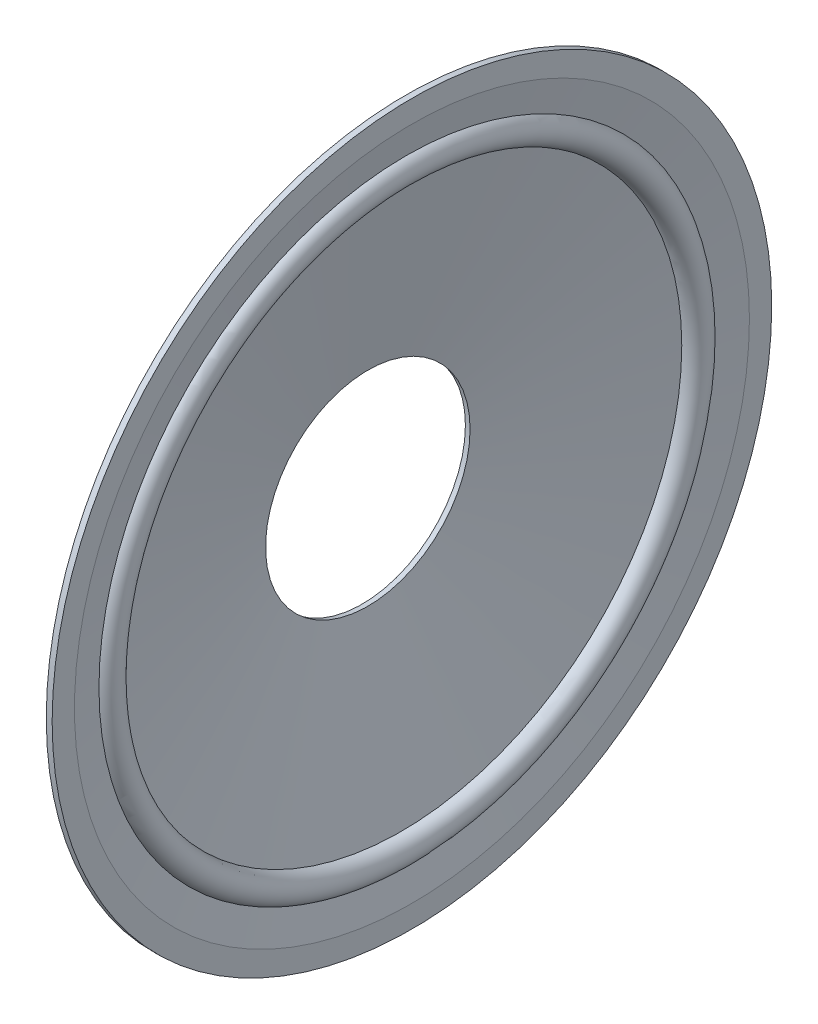
ISO-10303-21;
HEADER;
FILE_DESCRIPTION(('STEP AP214'),'2;1');
FILE_NAME('part.step','',(''),(''),'','','');
FILE_SCHEMA(('AUTOMOTIVE_DESIGN { 1 0 10303 214 1 1 1 1 }'));
ENDSEC;
DATA;
#1=APPLICATION_CONTEXT('core data for automotive mechanical design processes');
#2=APPLICATION_PROTOCOL_DEFINITION('international standard','automotive_design',2000,#1);
#3=PRODUCT_CONTEXT('',#1,'mechanical');
#4=PRODUCT('Part','Part','',(#3));
#5=PRODUCT_RELATED_PRODUCT_CATEGORY('part','',(#4));
#6=PRODUCT_DEFINITION_FORMATION('','',#4);
#7=PRODUCT_DEFINITION_CONTEXT('part definition',#1,'design');
#8=PRODUCT_DEFINITION('design','',#6,#7);
#9=PRODUCT_DEFINITION_SHAPE('','',#8);
#10=(LENGTH_UNIT() NAMED_UNIT(*) SI_UNIT(.MILLI.,.METRE.));
#11=(NAMED_UNIT(*) PLANE_ANGLE_UNIT() SI_UNIT($,.RADIAN.));
#12=(NAMED_UNIT(*) SI_UNIT($,.STERADIAN.) SOLID_ANGLE_UNIT());
#13=UNCERTAINTY_MEASURE_WITH_UNIT(LENGTH_MEASURE(1.E-05),#10,'distance_accuracy_value','');
#14=(GEOMETRIC_REPRESENTATION_CONTEXT(3) GLOBAL_UNCERTAINTY_ASSIGNED_CONTEXT((#13)) GLOBAL_UNIT_ASSIGNED_CONTEXT((#10,
#11,#12)) REPRESENTATION_CONTEXT('',''));
#15=CARTESIAN_POINT('',(0.,0.,0.));
#16=DIRECTION('',(0.,0.,1.));
#17=DIRECTION('',(1.,0.,0.));
#18=AXIS2_PLACEMENT_3D('',#15,#16,#17);
#19=CARTESIAN_POINT('',(3.,0.,0.));
#20=DIRECTION('',(1.,0.,0.));
#21=DIRECTION('',(0.,0.,-1.));
#22=AXIS2_PLACEMENT_3D('',#19,#20,#21);
#23=CYLINDRICAL_SURFACE('',#22,24.5);
#24=CARTESIAN_POINT('',(3.2,0.,0.));
#25=DIRECTION('',(1.,0.,0.));
#26=DIRECTION('',(0.,0.,-1.));
#27=AXIS2_PLACEMENT_3D('',#24,#25,#26);
#28=CIRCLE('',#27,24.5);
#29=CARTESIAN_POINT('',(3.2,0.,-24.5));
#30=VERTEX_POINT('',#29);
#31=EDGE_CURVE('E52',#30,#30,#28,.T.);
#32=ORIENTED_EDGE('',*,*,#31,.F.);
#33=EDGE_LOOP('',(#32));
#34=FACE_BOUND('',#33,.T.);
#35=CARTESIAN_POINT('',(2.8,0.,0.));
#36=DIRECTION('',(1.,0.,0.));
#37=DIRECTION('',(0.,0.,-1.));
#38=AXIS2_PLACEMENT_3D('',#35,#36,#37);
#39=CIRCLE('',#38,24.5);
#40=CARTESIAN_POINT('',(2.8,0.,-24.5));
#41=VERTEX_POINT('',#40);
#42=EDGE_CURVE('E37',#41,#41,#39,.T.);
#43=ORIENTED_EDGE('',*,*,#42,.T.);
#44=EDGE_LOOP('',(#43));
#45=FACE_BOUND('',#44,.T.);
#46=ADVANCED_FACE('F34',(#34,#45),#23,.T.);
#47=CARTESIAN_POINT('',(0.,0.,0.));
#48=DIRECTION('',(-1.,0.,0.));
#49=DIRECTION('',(0.,0.,1.));
#50=AXIS2_PLACEMENT_3D('',#47,#48,#49);
#51=CONICAL_SURFACE('',#50,7.,0.185347949995695);
#52=CARTESIAN_POINT('',(0.196574437386864,0.,0.));
#53=DIRECTION('',(1.,0.,0.));
#54=DIRECTION('',(0.,0.,-1.));
#55=AXIS2_PLACEMENT_3D('',#52,#53,#54);
#56=CIRCLE('',#55,6.96314229298996);
#57=CARTESIAN_POINT('',(0.196574437386864,0.,-6.96314229298996));
#58=VERTEX_POINT('',#57);
#59=EDGE_CURVE('E10',#58,#58,#56,.T.);
#60=ORIENTED_EDGE('',*,*,#59,.T.);
#61=EDGE_LOOP('',(#60));
#62=FACE_BOUND('',#61,.T.);
#63=CARTESIAN_POINT('',(-0.196574437386864,0.,0.));
#64=DIRECTION('',(1.,0.,0.));
#65=DIRECTION('',(0.,0.,-1.));
#66=AXIS2_PLACEMENT_3D('',#63,#64,#65);
#67=CIRCLE('',#66,7.03685770701004);
#68=CARTESIAN_POINT('',(-0.196574437386864,0.,-7.03685770701004));
#69=VERTEX_POINT('',#68);
#70=EDGE_CURVE('E58',#69,#69,#67,.T.);
#71=ORIENTED_EDGE('',*,*,#70,.F.);
#72=EDGE_LOOP('',(#71));
#73=FACE_BOUND('',#72,.T.);
#74=ADVANCED_FACE('F94',(#62,#73),#51,.F.);
#75=CARTESIAN_POINT('',(0.196574437386864,0.,0.));
#76=DIRECTION('',(1.,0.,0.));
#77=DIRECTION('',(0.,0.,-1.));
#78=AXIS2_PLACEMENT_3D('',#75,#76,#77);
#79=CONICAL_SURFACE('',#78,6.96314229298996,1.3854483767992);
#80=CARTESIAN_POINT('',(2.47255845148829,0.,0.));
#81=DIRECTION('',(1.,0.,0.));
#82=DIRECTION('',(0.,0.,-1.));
#83=AXIS2_PLACEMENT_3D('',#80,#81,#82);
#84=CIRCLE('',#83,19.1017237015309);
#85=CARTESIAN_POINT('',(2.47255845148829,0.,-19.1017237015309));
#86=VERTEX_POINT('',#85);
#87=EDGE_CURVE('E41',#86,#86,#84,.T.);
#88=ORIENTED_EDGE('',*,*,#87,.T.);
#89=EDGE_LOOP('',(#88));
#90=FACE_BOUND('',#89,.T.);
#91=ORIENTED_EDGE('',*,*,#59,.F.);
#92=EDGE_LOOP('',(#91));
#93=FACE_BOUND('',#92,.T.);
#94=ADVANCED_FACE('F99',(#90,#93),#79,.F.);
#95=CARTESIAN_POINT('',(2.44713439484944,0.,0.));
#96=DIRECTION('',(1.,0.,0.));
#97=DIRECTION('',(0.,0.,-1.));
#98=AXIS2_PLACEMENT_3D('',#95,#96,#97);
#99=TOROIDAL_SURFACE('',#98,20.051383439197,0.950000000000002);
#100=CARTESIAN_POINT('',(2.81485921298433,0.,0.));
#101=DIRECTION('',(-1.,0.,0.));
#102=DIRECTION('',(0.,0.,1.));
#103=AXIS2_PLACEMENT_3D('',#100,#101,#102);
#104=CIRCLE('',#103,20.9273277628431);
#105=CARTESIAN_POINT('',(2.81485921298433,0.,20.9273277628431));
#106=VERTEX_POINT('',#105);
#107=EDGE_CURVE('E46',#106,#106,#104,.F.);
#108=ORIENTED_EDGE('',*,*,#107,.T.);
#109=EDGE_LOOP('',(#108));
#110=FACE_BOUND('',#109,.T.);
#111=ORIENTED_EDGE('',*,*,#87,.F.);
#112=EDGE_LOOP('',(#111));
#113=FACE_BOUND('',#112,.T.);
#114=ADVANCED_FACE('F91',(#110,#113),#99,.T.);
#115=CARTESIAN_POINT('',(2.81485921298432,0.,0.));
#116=DIRECTION('',(1.,0.,0.));
#117=DIRECTION('',(0.,0.,-1.));
#118=AXIS2_PLACEMENT_3D('',#115,#116,#117);
#119=CONICAL_SURFACE('',#118,20.927327762843,1.3854483767992);
#120=CARTESIAN_POINT('',(3.2,0.,0.));
#121=DIRECTION('',(1.,0.,0.));
#122=DIRECTION('',(0.,0.,-1.));
#123=AXIS2_PLACEMENT_3D('',#120,#121,#122);
#124=CIRCLE('',#123,22.98141196026);
#125=CARTESIAN_POINT('',(3.2,0.,-22.98141196026));
#126=VERTEX_POINT('',#125);
#127=EDGE_CURVE('E50',#126,#126,#124,.T.);
#128=ORIENTED_EDGE('',*,*,#127,.T.);
#129=EDGE_LOOP('',(#128));
#130=FACE_BOUND('',#129,.T.);
#131=ORIENTED_EDGE('',*,*,#107,.F.);
#132=EDGE_LOOP('',(#131));
#133=FACE_BOUND('',#132,.T.);
#134=ADVANCED_FACE('F76',(#130,#133),#119,.F.);
#135=CARTESIAN_POINT('',(3.2,23.,0.));
#136=DIRECTION('',(1.,0.,0.));
#137=DIRECTION('',(0.,0.,-1.));
#138=AXIS2_PLACEMENT_3D('',#135,#136,#137);
#139=PLANE('',#138);
#140=ORIENTED_EDGE('',*,*,#31,.T.);
#141=EDGE_LOOP('',(#140));
#142=FACE_BOUND('',#141,.T.);
#143=ORIENTED_EDGE('',*,*,#127,.F.);
#144=EDGE_LOOP('',(#143));
#145=FACE_BOUND('',#144,.T.);
#146=ADVANCED_FACE('F79',(#142,#145),#139,.T.);
#147=CARTESIAN_POINT('',(-0.196574437386864,0.,0.));
#148=DIRECTION('',(1.,0.,0.));
#149=DIRECTION('',(0.,0.,-1.));
#150=AXIS2_PLACEMENT_3D('',#147,#148,#149);
#151=CONICAL_SURFACE('',#150,7.03685770701004,1.3854483767992);
#152=CARTESIAN_POINT('',(2.07940957671457,0.,0.));
#153=DIRECTION('',(1.,0.,0.));
#154=DIRECTION('',(0.,0.,-1.));
#155=AXIS2_PLACEMENT_3D('',#152,#153,#154);
#156=CIRCLE('',#155,19.175439115551);
#157=CARTESIAN_POINT('',(2.07940957671457,0.,-19.175439115551));
#158=VERTEX_POINT('',#157);
#159=EDGE_CURVE('E55',#158,#158,#156,.T.);
#160=ORIENTED_EDGE('',*,*,#159,.F.);
#161=EDGE_LOOP('',(#160));
#162=FACE_BOUND('',#161,.T.);
#163=ORIENTED_EDGE('',*,*,#70,.T.);
#164=EDGE_LOOP('',(#163));
#165=FACE_BOUND('',#164,.T.);
#166=ADVANCED_FACE('F81',(#162,#165),#151,.T.);
#167=CARTESIAN_POINT('',(2.4725584514883,0.,0.));
#168=DIRECTION('',(1.,0.,0.));
#169=DIRECTION('',(0.,0.,-1.));
#170=AXIS2_PLACEMENT_3D('',#167,#168,#169);
#171=TOROIDAL_SURFACE('',#170,19.1017237015309,0.399999999999998);
#172=CARTESIAN_POINT('',(2.4618535855351,0.,0.));
#173=DIRECTION('',(1.,0.,0.));
#174=DIRECTION('',(0.,0.,-1.));
#175=AXIS2_PLACEMENT_3D('',#172,#173,#174);
#176=CIRCLE('',#175,19.5015804331798);
#177=CARTESIAN_POINT('',(2.4618535855351,0.,-19.5015804331798));
#178=VERTEX_POINT('',#177);
#179=EDGE_CURVE('E59',#178,#178,#176,.T.);
#180=ORIENTED_EDGE('',*,*,#179,.F.);
#181=EDGE_LOOP('',(#180));
#182=FACE_BOUND('',#181,.T.);
#183=ORIENTED_EDGE('',*,*,#159,.T.);
#184=EDGE_LOOP('',(#183));
#185=FACE_BOUND('',#184,.T.);
#186=ADVANCED_FACE('F88',(#182,#185),#171,.T.);
#187=CARTESIAN_POINT('',(2.44713439484944,0.,0.));
#188=DIRECTION('',(1.,0.,0.));
#189=DIRECTION('',(0.,0.,-1.));
#190=AXIS2_PLACEMENT_3D('',#187,#188,#189);
#191=TOROIDAL_SURFACE('',#190,20.051383439197,0.550000000000002);
#192=CARTESIAN_POINT('',(2.66002771061174,0.,0.));
#193=DIRECTION('',(1.,0.,0.));
#194=DIRECTION('',(0.,0.,-1.));
#195=AXIS2_PLACEMENT_3D('',#192,#193,#194);
#196=CIRCLE('',#195,20.5585091002553);
#197=CARTESIAN_POINT('',(2.66002771061174,0.,-20.5585091002553));
#198=VERTEX_POINT('',#197);
#199=EDGE_CURVE('E62',#198,#198,#196,.T.);
#200=ORIENTED_EDGE('',*,*,#199,.F.);
#201=EDGE_LOOP('',(#200));
#202=FACE_BOUND('',#201,.T.);
#203=ORIENTED_EDGE('',*,*,#179,.T.);
#204=EDGE_LOOP('',(#203));
#205=FACE_BOUND('',#204,.T.);
#206=ADVANCED_FACE('F120',(#202,#205),#191,.F.);
#207=CARTESIAN_POINT('',(2.81485921298432,0.,0.));
#208=DIRECTION('',(1.,0.,0.));
#209=DIRECTION('',(0.,0.,-1.));
#210=AXIS2_PLACEMENT_3D('',#207,#208,#209);
#211=TOROIDAL_SURFACE('',#210,20.927327762843,0.399999999999999);
#212=CARTESIAN_POINT('',(2.42171033821059,0.,0.));
#213=DIRECTION('',(1.,0.,0.));
#214=DIRECTION('',(0.,0.,-1.));
#215=AXIS2_PLACEMENT_3D('',#212,#213,#214);
#216=CIRCLE('',#215,21.0010431768631);
#217=CARTESIAN_POINT('',(2.42171033821059,0.,-21.0010431768631));
#218=VERTEX_POINT('',#217);
#219=EDGE_CURVE('E65',#218,#218,#216,.T.);
#220=ORIENTED_EDGE('',*,*,#219,.F.);
#221=EDGE_LOOP('',(#220));
#222=FACE_BOUND('',#221,.T.);
#223=ORIENTED_EDGE('',*,*,#199,.T.);
#224=EDGE_LOOP('',(#223));
#225=FACE_BOUND('',#224,.T.);
#226=ADVANCED_FACE('F114',(#222,#225),#211,.T.);
#227=CARTESIAN_POINT('',(2.42171033821059,0.,0.));
#228=DIRECTION('',(1.,0.,0.));
#229=DIRECTION('',(0.,0.,-1.));
#230=AXIS2_PLACEMENT_3D('',#227,#228,#229);
#231=CONICAL_SURFACE('',#230,21.0010431768631,1.3854483767992);
#232=CARTESIAN_POINT('',(2.8,0.,0.));
#233=DIRECTION('',(1.,0.,0.));
#234=DIRECTION('',(0.,0.,-1.));
#235=AXIS2_PLACEMENT_3D('',#232,#233,#234);
#236=CIRCLE('',#235,23.01858803974);
#237=CARTESIAN_POINT('',(2.8,0.,-23.01858803974));
#238=VERTEX_POINT('',#237);
#239=EDGE_CURVE('E68',#238,#238,#236,.T.);
#240=ORIENTED_EDGE('',*,*,#239,.F.);
#241=EDGE_LOOP('',(#240));
#242=FACE_BOUND('',#241,.T.);
#243=ORIENTED_EDGE('',*,*,#219,.T.);
#244=EDGE_LOOP('',(#243));
#245=FACE_BOUND('',#244,.T.);
#246=ADVANCED_FACE('F108',(#242,#245),#231,.T.);
#247=CARTESIAN_POINT('',(2.8,23.,0.));
#248=DIRECTION('',(1.,0.,0.));
#249=DIRECTION('',(0.,0.,-1.));
#250=AXIS2_PLACEMENT_3D('',#247,#248,#249);
#251=PLANE('',#250);
#252=ORIENTED_EDGE('',*,*,#42,.F.);
#253=EDGE_LOOP('',(#252));
#254=FACE_BOUND('',#253,.T.);
#255=ORIENTED_EDGE('',*,*,#239,.T.);
#256=EDGE_LOOP('',(#255));
#257=FACE_BOUND('',#256,.T.);
#258=ADVANCED_FACE('F105',(#254,#257),#251,.F.);
#259=CLOSED_SHELL('',(#46,#74,#94,#114,#134,#146,#166,#186,#206,#226,#246,#258));
#260=MANIFOLD_SOLID_BREP('B2',#259);
#261=ADVANCED_BREP_SHAPE_REPRESENTATION('',(#18,#260),#14);
#262=SHAPE_DEFINITION_REPRESENTATION(#9,#261);
ENDSEC;
END-ISO-10303-21;
